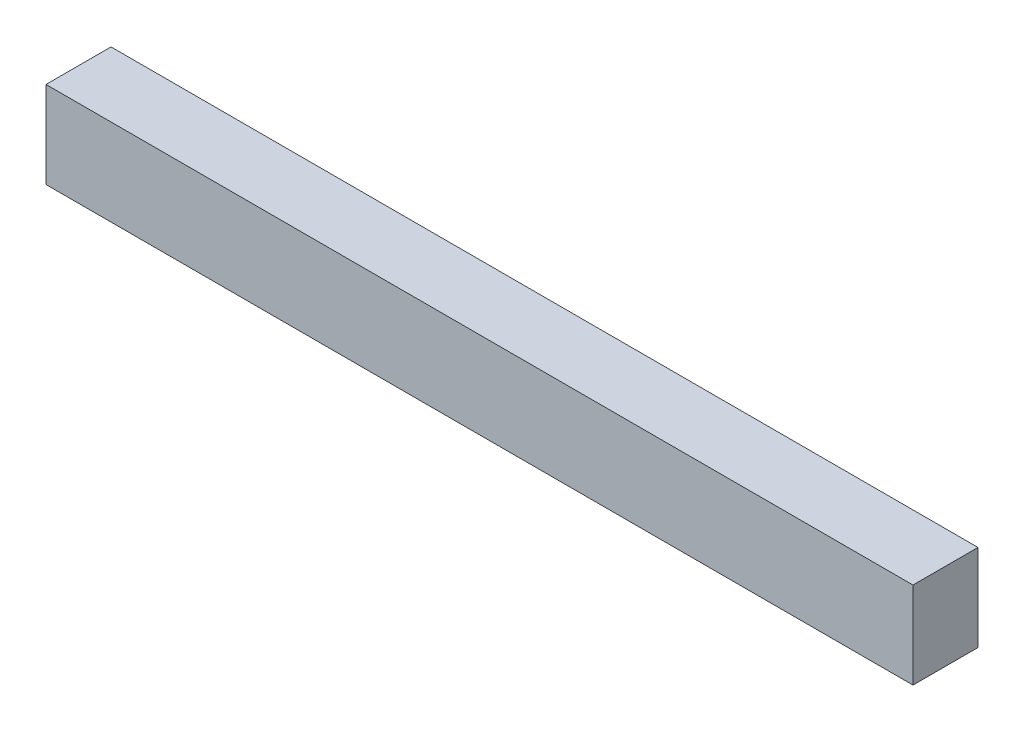
ISO-10303-21;
HEADER;
FILE_DESCRIPTION(('STEP AP214'),'2;1');
FILE_NAME('part.step','',(''),(''),'','','');
FILE_SCHEMA(('AUTOMOTIVE_DESIGN { 1 0 10303 214 1 1 1 1 }'));
ENDSEC;
DATA;
#1=APPLICATION_CONTEXT('core data for automotive mechanical design processes');
#2=APPLICATION_PROTOCOL_DEFINITION('international standard','automotive_design',2000,#1);
#3=PRODUCT_CONTEXT('',#1,'mechanical');
#4=PRODUCT('Part','Part','',(#3));
#5=PRODUCT_RELATED_PRODUCT_CATEGORY('part','',(#4));
#6=PRODUCT_DEFINITION_FORMATION('','',#4);
#7=PRODUCT_DEFINITION_CONTEXT('part definition',#1,'design');
#8=PRODUCT_DEFINITION('design','',#6,#7);
#9=PRODUCT_DEFINITION_SHAPE('','',#8);
#10=(LENGTH_UNIT() NAMED_UNIT(*) SI_UNIT(.MILLI.,.METRE.));
#11=(NAMED_UNIT(*) PLANE_ANGLE_UNIT() SI_UNIT($,.RADIAN.));
#12=(NAMED_UNIT(*) SI_UNIT($,.STERADIAN.) SOLID_ANGLE_UNIT());
#13=UNCERTAINTY_MEASURE_WITH_UNIT(LENGTH_MEASURE(1.E-05),#10,'distance_accuracy_value','');
#14=(GEOMETRIC_REPRESENTATION_CONTEXT(3) GLOBAL_UNCERTAINTY_ASSIGNED_CONTEXT((#13)) GLOBAL_UNIT_ASSIGNED_CONTEXT((#10,
#11,#12)) REPRESENTATION_CONTEXT('',''));
#15=CARTESIAN_POINT('',(0.,0.,0.));
#16=DIRECTION('',(0.,0.,1.));
#17=DIRECTION('',(1.,0.,0.));
#18=AXIS2_PLACEMENT_3D('',#15,#16,#17);
#19=CARTESIAN_POINT('',(0.,4.,0.));
#20=DIRECTION('',(1.,0.,0.));
#21=DIRECTION('',(0.,0.,-1.));
#22=AXIS2_PLACEMENT_3D('',#19,#20,#21);
#23=PLANE('',#22);
#24=DIRECTION('',(0.,0.,1.));
#25=VECTOR('',#24,1.);
#26=CARTESIAN_POINT('',(0.,0.,0.));
#27=LINE('',#26,#25);
#28=CARTESIAN_POINT('',(0.,0.,-3.));
#29=VERTEX_POINT('',#28);
#30=CARTESIAN_POINT('',(0.,0.,0.));
#31=VERTEX_POINT('',#30);
#32=EDGE_CURVE('E109',#29,#31,#27,.T.);
#33=ORIENTED_EDGE('',*,*,#32,.T.);
#34=DIRECTION('',(0.,-1.,0.));
#35=VECTOR('',#34,1.);
#36=CARTESIAN_POINT('',(0.,4.,0.));
#37=LINE('',#36,#35);
#38=CARTESIAN_POINT('',(0.,4.,0.));
#39=VERTEX_POINT('',#38);
#40=EDGE_CURVE('E11',#39,#31,#37,.T.);
#41=ORIENTED_EDGE('',*,*,#40,.F.);
#42=DIRECTION('',(0.,0.,1.));
#43=VECTOR('',#42,1.);
#44=CARTESIAN_POINT('',(0.,4.,0.));
#45=LINE('',#44,#43);
#46=CARTESIAN_POINT('',(0.,4.,-3.));
#47=VERTEX_POINT('',#46);
#48=EDGE_CURVE('E93',#47,#39,#45,.T.);
#49=ORIENTED_EDGE('',*,*,#48,.F.);
#50=DIRECTION('',(0.,-1.,0.));
#51=VECTOR('',#50,1.);
#52=CARTESIAN_POINT('',(0.,4.,-3.));
#53=LINE('',#52,#51);
#54=EDGE_CURVE('E105',#47,#29,#53,.T.);
#55=ORIENTED_EDGE('',*,*,#54,.T.);
#56=EDGE_LOOP('',(#33,#41,#49,#55));
#57=FACE_BOUND('',#56,.T.);
#58=ADVANCED_FACE('F41',(#57),#23,.F.);
#59=CARTESIAN_POINT('',(0.,4.,0.));
#60=DIRECTION('',(0.,0.,-1.));
#61=DIRECTION('',(-1.,0.,0.));
#62=AXIS2_PLACEMENT_3D('',#59,#60,#61);
#63=PLANE('',#62);
#64=DIRECTION('',(1.,0.,0.));
#65=VECTOR('',#64,1.);
#66=CARTESIAN_POINT('',(0.,0.,0.));
#67=LINE('',#66,#65);
#68=CARTESIAN_POINT('',(40.,0.,0.));
#69=VERTEX_POINT('',#68);
#70=EDGE_CURVE('E98',#31,#69,#67,.T.);
#71=ORIENTED_EDGE('',*,*,#70,.T.);
#72=DIRECTION('',(0.,-1.,0.));
#73=VECTOR('',#72,1.);
#74=CARTESIAN_POINT('',(40.,4.,0.));
#75=LINE('',#74,#73);
#76=CARTESIAN_POINT('',(40.,4.,0.));
#77=VERTEX_POINT('',#76);
#78=EDGE_CURVE('E50',#77,#69,#75,.T.);
#79=ORIENTED_EDGE('',*,*,#78,.F.);
#80=DIRECTION('',(1.,0.,0.));
#81=VECTOR('',#80,1.);
#82=CARTESIAN_POINT('',(0.,4.,0.));
#83=LINE('',#82,#81);
#84=EDGE_CURVE('E88',#39,#77,#83,.T.);
#85=ORIENTED_EDGE('',*,*,#84,.F.);
#86=ORIENTED_EDGE('',*,*,#40,.T.);
#87=EDGE_LOOP('',(#71,#79,#85,#86));
#88=FACE_BOUND('',#87,.T.);
#89=ADVANCED_FACE('F97',(#88),#63,.F.);
#90=CARTESIAN_POINT('',(40.,4.,0.));
#91=DIRECTION('',(-1.,0.,0.));
#92=DIRECTION('',(0.,0.,1.));
#93=AXIS2_PLACEMENT_3D('',#90,#91,#92);
#94=PLANE('',#93);
#95=DIRECTION('',(0.,0.,-1.));
#96=VECTOR('',#95,1.);
#97=CARTESIAN_POINT('',(40.,0.,0.));
#98=LINE('',#97,#96);
#99=CARTESIAN_POINT('',(40.,0.,-3.));
#100=VERTEX_POINT('',#99);
#101=EDGE_CURVE('E75',#69,#100,#98,.T.);
#102=ORIENTED_EDGE('',*,*,#101,.T.);
#103=DIRECTION('',(0.,-1.,0.));
#104=VECTOR('',#103,1.);
#105=CARTESIAN_POINT('',(40.,4.,-3.));
#106=LINE('',#105,#104);
#107=CARTESIAN_POINT('',(40.,4.,-3.));
#108=VERTEX_POINT('',#107);
#109=EDGE_CURVE('E100',#108,#100,#106,.T.);
#110=ORIENTED_EDGE('',*,*,#109,.F.);
#111=DIRECTION('',(0.,0.,-1.));
#112=VECTOR('',#111,1.);
#113=CARTESIAN_POINT('',(40.,4.,0.));
#114=LINE('',#113,#112);
#115=EDGE_CURVE('E91',#77,#108,#114,.T.);
#116=ORIENTED_EDGE('',*,*,#115,.F.);
#117=ORIENTED_EDGE('',*,*,#78,.T.);
#118=EDGE_LOOP('',(#102,#110,#116,#117));
#119=FACE_BOUND('',#118,.T.);
#120=ADVANCED_FACE('F101',(#119),#94,.F.);
#121=CARTESIAN_POINT('',(0.,4.,-3.));
#122=DIRECTION('',(0.,0.,1.));
#123=DIRECTION('',(1.,0.,0.));
#124=AXIS2_PLACEMENT_3D('',#121,#122,#123);
#125=PLANE('',#124);
#126=DIRECTION('',(-1.,0.,0.));
#127=VECTOR('',#126,1.);
#128=CARTESIAN_POINT('',(0.,0.,-3.));
#129=LINE('',#128,#127);
#130=EDGE_CURVE('E81',#100,#29,#129,.T.);
#131=ORIENTED_EDGE('',*,*,#130,.T.);
#132=ORIENTED_EDGE('',*,*,#54,.F.);
#133=DIRECTION('',(-1.,0.,0.));
#134=VECTOR('',#133,1.);
#135=CARTESIAN_POINT('',(0.,4.,-3.));
#136=LINE('',#135,#134);
#137=EDGE_CURVE('E58',#108,#47,#136,.T.);
#138=ORIENTED_EDGE('',*,*,#137,.F.);
#139=ORIENTED_EDGE('',*,*,#109,.T.);
#140=EDGE_LOOP('',(#131,#132,#138,#139));
#141=FACE_BOUND('',#140,.T.);
#142=ADVANCED_FACE('F122',(#141),#125,.F.);
#143=CARTESIAN_POINT('',(0.,4.,0.));
#144=DIRECTION('',(0.,-1.,0.));
#145=DIRECTION('',(0.,0.,-1.));
#146=AXIS2_PLACEMENT_3D('',#143,#144,#145);
#147=PLANE('',#146);
#148=ORIENTED_EDGE('',*,*,#48,.T.);
#149=ORIENTED_EDGE('',*,*,#84,.T.);
#150=ORIENTED_EDGE('',*,*,#115,.T.);
#151=ORIENTED_EDGE('',*,*,#137,.T.);
#152=EDGE_LOOP('',(#148,#149,#150,#151));
#153=FACE_BOUND('',#152,.T.);
#154=ADVANCED_FACE('F89',(#153),#147,.F.);
#155=CARTESIAN_POINT('',(0.,0.,0.));
#156=DIRECTION('',(0.,-1.,0.));
#157=DIRECTION('',(0.,0.,-1.));
#158=AXIS2_PLACEMENT_3D('',#155,#156,#157);
#159=PLANE('',#158);
#160=ORIENTED_EDGE('',*,*,#32,.F.);
#161=ORIENTED_EDGE('',*,*,#130,.F.);
#162=ORIENTED_EDGE('',*,*,#101,.F.);
#163=ORIENTED_EDGE('',*,*,#70,.F.);
#164=EDGE_LOOP('',(#160,#161,#162,#163));
#165=FACE_BOUND('',#164,.T.);
#166=ADVANCED_FACE('F125',(#165),#159,.T.);
#167=CLOSED_SHELL('',(#58,#89,#120,#142,#154,#166));
#168=MANIFOLD_SOLID_BREP('B2',#167);
#169=ADVANCED_BREP_SHAPE_REPRESENTATION('',(#18,#168),#14);
#170=SHAPE_DEFINITION_REPRESENTATION(#9,#169);
ENDSEC;
END-ISO-10303-21;
